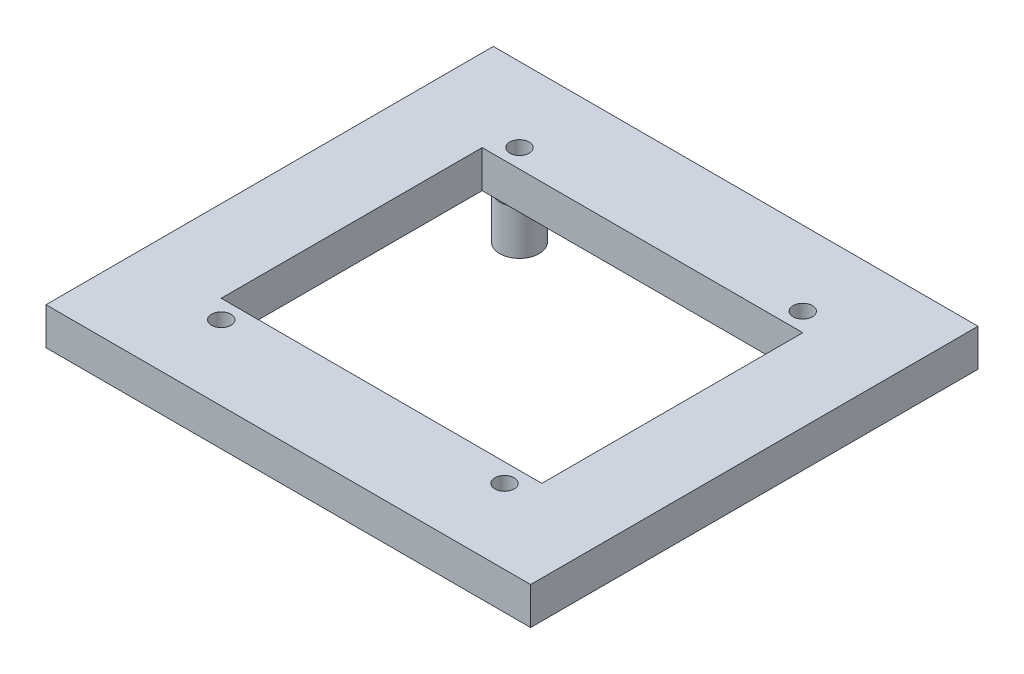
ISO-10303-21;
HEADER;
FILE_DESCRIPTION(('STEP AP214'),'2;1');
FILE_NAME('part.step','',(''),(''),'','','');
FILE_SCHEMA(('AUTOMOTIVE_DESIGN { 1 0 10303 214 1 1 1 1 }'));
ENDSEC;
DATA;
#1=APPLICATION_CONTEXT('core data for automotive mechanical design processes');
#2=APPLICATION_PROTOCOL_DEFINITION('international standard','automotive_design',2000,#1);
#3=PRODUCT_CONTEXT('',#1,'mechanical');
#4=PRODUCT('Part','Part','',(#3));
#5=PRODUCT_RELATED_PRODUCT_CATEGORY('part','',(#4));
#6=PRODUCT_DEFINITION_FORMATION('','',#4);
#7=PRODUCT_DEFINITION_CONTEXT('part definition',#1,'design');
#8=PRODUCT_DEFINITION('design','',#6,#7);
#9=PRODUCT_DEFINITION_SHAPE('','',#8);
#10=(LENGTH_UNIT() NAMED_UNIT(*) SI_UNIT(.MILLI.,.METRE.));
#11=(NAMED_UNIT(*) PLANE_ANGLE_UNIT() SI_UNIT($,.RADIAN.));
#12=(NAMED_UNIT(*) SI_UNIT($,.STERADIAN.) SOLID_ANGLE_UNIT());
#13=UNCERTAINTY_MEASURE_WITH_UNIT(LENGTH_MEASURE(1.E-05),#10,'distance_accuracy_value','');
#14=(GEOMETRIC_REPRESENTATION_CONTEXT(3) GLOBAL_UNCERTAINTY_ASSIGNED_CONTEXT((#13)) GLOBAL_UNIT_ASSIGNED_CONTEXT((#10,
#11,#12)) REPRESENTATION_CONTEXT('',''));
#15=CARTESIAN_POINT('',(0.,0.,0.));
#16=DIRECTION('',(0.,0.,1.));
#17=DIRECTION('',(1.,0.,0.));
#18=AXIS2_PLACEMENT_3D('',#15,#16,#17);
#19=CARTESIAN_POINT('',(-47.,5.,-30.));
#20=DIRECTION('',(0.,0.,-1.));
#21=DIRECTION('',(-1.,0.,0.));
#22=AXIS2_PLACEMENT_3D('',#19,#20,#21);
#23=PLANE('',#22);
#24=DIRECTION('',(1.,0.,0.));
#25=VECTOR('',#24,1.);
#26=CARTESIAN_POINT('',(-47.,0.,-30.));
#27=LINE('',#26,#25);
#28=CARTESIAN_POINT('',(-47.,0.,-30.));
#29=VERTEX_POINT('',#28);
#30=CARTESIAN_POINT('',(18.,0.,-30.));
#31=VERTEX_POINT('',#30);
#32=EDGE_CURVE('E196',#29,#31,#27,.T.);
#33=ORIENTED_EDGE('',*,*,#32,.F.);
#34=DIRECTION('',(0.,-1.,0.));
#35=VECTOR('',#34,1.);
#36=CARTESIAN_POINT('',(-47.,5.,-30.));
#37=LINE('',#36,#35);
#38=CARTESIAN_POINT('',(-47.,5.,-30.));
#39=VERTEX_POINT('',#38);
#40=EDGE_CURVE('E11',#39,#29,#37,.T.);
#41=ORIENTED_EDGE('',*,*,#40,.F.);
#42=DIRECTION('',(1.,0.,0.));
#43=VECTOR('',#42,1.);
#44=CARTESIAN_POINT('',(-47.,5.,-30.));
#45=LINE('',#44,#43);
#46=CARTESIAN_POINT('',(18.,5.,-30.));
#47=VERTEX_POINT('',#46);
#48=EDGE_CURVE('E197',#39,#47,#45,.T.);
#49=ORIENTED_EDGE('',*,*,#48,.T.);
#50=DIRECTION('',(0.,-1.,0.));
#51=VECTOR('',#50,1.);
#52=CARTESIAN_POINT('',(18.,5.,-30.));
#53=LINE('',#52,#51);
#54=EDGE_CURVE('E46',#47,#31,#53,.T.);
#55=ORIENTED_EDGE('',*,*,#54,.T.);
#56=EDGE_LOOP('',(#33,#41,#49,#55));
#57=FACE_BOUND('',#56,.T.);
#58=ADVANCED_FACE('F43',(#57),#23,.T.);
#59=CARTESIAN_POINT('',(-47.,5.,-30.));
#60=DIRECTION('',(1.,0.,0.));
#61=DIRECTION('',(0.,0.,-1.));
#62=AXIS2_PLACEMENT_3D('',#59,#60,#61);
#63=PLANE('',#62);
#64=DIRECTION('',(0.,0.,1.));
#65=VECTOR('',#64,1.);
#66=CARTESIAN_POINT('',(-47.,0.,-30.));
#67=LINE('',#66,#65);
#68=CARTESIAN_POINT('',(-47.,0.,30.));
#69=VERTEX_POINT('',#68);
#70=EDGE_CURVE('E201',#29,#69,#67,.T.);
#71=ORIENTED_EDGE('',*,*,#70,.T.);
#72=DIRECTION('',(0.,-1.,0.));
#73=VECTOR('',#72,1.);
#74=CARTESIAN_POINT('',(-47.,5.,30.));
#75=LINE('',#74,#73);
#76=CARTESIAN_POINT('',(-47.,5.,30.));
#77=VERTEX_POINT('',#76);
#78=EDGE_CURVE('E51',#77,#69,#75,.T.);
#79=ORIENTED_EDGE('',*,*,#78,.F.);
#80=DIRECTION('',(0.,0.,1.));
#81=VECTOR('',#80,1.);
#82=CARTESIAN_POINT('',(-47.,5.,-30.));
#83=LINE('',#82,#81);
#84=EDGE_CURVE('E206',#39,#77,#83,.T.);
#85=ORIENTED_EDGE('',*,*,#84,.F.);
#86=ORIENTED_EDGE('',*,*,#40,.T.);
#87=EDGE_LOOP('',(#71,#79,#85,#86));
#88=FACE_BOUND('',#87,.T.);
#89=ADVANCED_FACE('F231',(#88),#63,.F.);
#90=CARTESIAN_POINT('',(-47.,5.,30.));
#91=DIRECTION('',(0.,0.,-1.));
#92=DIRECTION('',(-1.,0.,0.));
#93=AXIS2_PLACEMENT_3D('',#90,#91,#92);
#94=PLANE('',#93);
#95=DIRECTION('',(1.,0.,0.));
#96=VECTOR('',#95,1.);
#97=CARTESIAN_POINT('',(-47.,0.,30.));
#98=LINE('',#97,#96);
#99=CARTESIAN_POINT('',(18.,0.,30.));
#100=VERTEX_POINT('',#99);
#101=EDGE_CURVE('E213',#69,#100,#98,.T.);
#102=ORIENTED_EDGE('',*,*,#101,.T.);
#103=DIRECTION('',(0.,-1.,0.));
#104=VECTOR('',#103,1.);
#105=CARTESIAN_POINT('',(18.,5.,30.));
#106=LINE('',#105,#104);
#107=CARTESIAN_POINT('',(18.,5.,30.));
#108=VERTEX_POINT('',#107);
#109=EDGE_CURVE('E218',#108,#100,#106,.T.);
#110=ORIENTED_EDGE('',*,*,#109,.F.);
#111=DIRECTION('',(1.,0.,0.));
#112=VECTOR('',#111,1.);
#113=CARTESIAN_POINT('',(-47.,5.,30.));
#114=LINE('',#113,#112);
#115=EDGE_CURVE('E204',#77,#108,#114,.T.);
#116=ORIENTED_EDGE('',*,*,#115,.F.);
#117=ORIENTED_EDGE('',*,*,#78,.T.);
#118=EDGE_LOOP('',(#102,#110,#116,#117));
#119=FACE_BOUND('',#118,.T.);
#120=ADVANCED_FACE('F235',(#119),#94,.F.);
#121=CARTESIAN_POINT('',(18.,5.,-30.));
#122=DIRECTION('',(1.,0.,0.));
#123=DIRECTION('',(0.,0.,-1.));
#124=AXIS2_PLACEMENT_3D('',#121,#122,#123);
#125=PLANE('',#124);
#126=DIRECTION('',(0.,0.,1.));
#127=VECTOR('',#126,1.);
#128=CARTESIAN_POINT('',(18.,0.,-30.));
#129=LINE('',#128,#127);
#130=EDGE_CURVE('E210',#31,#100,#129,.T.);
#131=ORIENTED_EDGE('',*,*,#130,.F.);
#132=ORIENTED_EDGE('',*,*,#54,.F.);
#133=DIRECTION('',(0.,0.,1.));
#134=VECTOR('',#133,1.);
#135=CARTESIAN_POINT('',(18.,5.,-30.));
#136=LINE('',#135,#134);
#137=EDGE_CURVE('E200',#47,#108,#136,.T.);
#138=ORIENTED_EDGE('',*,*,#137,.T.);
#139=ORIENTED_EDGE('',*,*,#109,.T.);
#140=EDGE_LOOP('',(#131,#132,#138,#139));
#141=FACE_BOUND('',#140,.T.);
#142=ADVANCED_FACE('F226',(#141),#125,.T.);
#143=CARTESIAN_POINT('',(0.,5.,0.));
#144=DIRECTION('',(0.,-1.,0.));
#145=DIRECTION('',(0.,0.,-1.));
#146=AXIS2_PLACEMENT_3D('',#143,#144,#145);
#147=PLANE('',#146);
#148=CARTESIAN_POINT('',(-33.5,5.,20.));
#149=DIRECTION('',(0.,1.,0.));
#150=DIRECTION('',(0.,0.,1.));
#151=AXIS2_PLACEMENT_3D('',#148,#149,#150);
#152=CIRCLE('',#151,1.29999999999999);
#153=CARTESIAN_POINT('',(-33.5,5.,21.3));
#154=VERTEX_POINT('',#153);
#155=EDGE_CURVE('E584',#154,#154,#152,.T.);
#156=ORIENTED_EDGE('',*,*,#155,.F.);
#157=EDGE_LOOP('',(#156));
#158=FACE_BOUND('',#157,.T.);
#159=CARTESIAN_POINT('',(4.50000000000001,5.,20.));
#160=DIRECTION('',(0.,1.,0.));
#161=DIRECTION('',(0.,0.,1.));
#162=AXIS2_PLACEMENT_3D('',#159,#160,#161);
#163=CIRCLE('',#162,1.3);
#164=CARTESIAN_POINT('',(4.50000000000001,5.,21.3));
#165=VERTEX_POINT('',#164);
#166=EDGE_CURVE('E598',#165,#165,#163,.T.);
#167=ORIENTED_EDGE('',*,*,#166,.F.);
#168=EDGE_LOOP('',(#167));
#169=FACE_BOUND('',#168,.T.);
#170=CARTESIAN_POINT('',(4.49999999999999,5.,-20.));
#171=DIRECTION('',(0.,1.,0.));
#172=DIRECTION('',(0.,0.,1.));
#173=AXIS2_PLACEMENT_3D('',#170,#171,#172);
#174=CIRCLE('',#173,1.3);
#175=CARTESIAN_POINT('',(4.49999999999999,5.,-18.7));
#176=VERTEX_POINT('',#175);
#177=EDGE_CURVE('E592',#176,#176,#174,.T.);
#178=ORIENTED_EDGE('',*,*,#177,.F.);
#179=EDGE_LOOP('',(#178));
#180=FACE_BOUND('',#179,.T.);
#181=CARTESIAN_POINT('',(-33.5,5.,-20.));
#182=DIRECTION('',(0.,1.,0.));
#183=DIRECTION('',(0.,0.,1.));
#184=AXIS2_PLACEMENT_3D('',#181,#182,#183);
#185=CIRCLE('',#184,1.29999999999999);
#186=CARTESIAN_POINT('',(-33.5,5.,-18.7));
#187=VERTEX_POINT('',#186);
#188=EDGE_CURVE('E606',#187,#187,#185,.T.);
#189=ORIENTED_EDGE('',*,*,#188,.F.);
#190=EDGE_LOOP('',(#189));
#191=FACE_BOUND('',#190,.T.);
#192=DIRECTION('',(-1.,0.,0.));
#193=VECTOR('',#192,1.);
#194=CARTESIAN_POINT('',(0.,5.,17.5));
#195=LINE('',#194,#193);
#196=CARTESIAN_POINT('',(7.00000000000001,5.,17.5));
#197=VERTEX_POINT('',#196);
#198=CARTESIAN_POINT('',(-36.,5.,17.5));
#199=VERTEX_POINT('',#198);
#200=EDGE_CURVE('E190',#197,#199,#195,.T.);
#201=ORIENTED_EDGE('',*,*,#200,.T.);
#202=DIRECTION('',(0.,0.,-1.));
#203=VECTOR('',#202,1.);
#204=CARTESIAN_POINT('',(-36.,5.,0.));
#205=LINE('',#204,#203);
#206=CARTESIAN_POINT('',(-36.,5.,-17.5));
#207=VERTEX_POINT('',#206);
#208=EDGE_CURVE('E193',#199,#207,#205,.T.);
#209=ORIENTED_EDGE('',*,*,#208,.T.);
#210=DIRECTION('',(1.,0.,0.));
#211=VECTOR('',#210,1.);
#212=CARTESIAN_POINT('',(0.,5.,-17.5));
#213=LINE('',#212,#211);
#214=CARTESIAN_POINT('',(7.00000000000001,5.,-17.5));
#215=VERTEX_POINT('',#214);
#216=EDGE_CURVE('E178',#207,#215,#213,.T.);
#217=ORIENTED_EDGE('',*,*,#216,.T.);
#218=DIRECTION('',(0.,0.,1.));
#219=VECTOR('',#218,1.);
#220=CARTESIAN_POINT('',(7.00000000000001,5.,0.));
#221=LINE('',#220,#219);
#222=EDGE_CURVE('E187',#215,#197,#221,.T.);
#223=ORIENTED_EDGE('',*,*,#222,.T.);
#224=EDGE_LOOP('',(#201,#209,#217,#223));
#225=FACE_BOUND('',#224,.T.);
#226=ORIENTED_EDGE('',*,*,#48,.F.);
#227=ORIENTED_EDGE('',*,*,#84,.T.);
#228=ORIENTED_EDGE('',*,*,#115,.T.);
#229=ORIENTED_EDGE('',*,*,#137,.F.);
#230=EDGE_LOOP('',(#226,#227,#228,#229));
#231=FACE_BOUND('',#230,.T.);
#232=ADVANCED_FACE('F237',(#158,#169,#180,#191,#225,#231),#147,.F.);
#233=CARTESIAN_POINT('',(0.,0.,0.));
#234=DIRECTION('',(0.,-1.,0.));
#235=DIRECTION('',(0.,0.,-1.));
#236=AXIS2_PLACEMENT_3D('',#233,#234,#235);
#237=PLANE('',#236);
#238=DIRECTION('',(1.,0.,0.));
#239=VECTOR('',#238,1.);
#240=CARTESIAN_POINT('',(-36.,0.,-17.5));
#241=LINE('',#240,#239);
#242=CARTESIAN_POINT('',(5.3789197915623,0.,-17.5));
#243=VERTEX_POINT('',#242);
#244=CARTESIAN_POINT('',(7.00000000000001,0.,-17.5));
#245=VERTEX_POINT('',#244);
#246=EDGE_CURVE('E153',#243,#245,#241,.T.);
#247=ORIENTED_EDGE('',*,*,#246,.F.);
#248=CARTESIAN_POINT('',(4.49999999999999,0.,-20.));
#249=DIRECTION('',(0.,-1.,0.));
#250=DIRECTION('',(0.,0.,-1.));
#251=AXIS2_PLACEMENT_3D('',#248,#249,#250);
#252=CIRCLE('',#251,2.65);
#253=CARTESIAN_POINT('',(3.62108020843768,0.,-17.5));
#254=VERTEX_POINT('',#253);
#255=EDGE_CURVE('E141',#254,#243,#252,.T.);
#256=ORIENTED_EDGE('',*,*,#255,.F.);
#257=CARTESIAN_POINT('',(-32.6210802084376,0.,-17.5));
#258=VERTEX_POINT('',#257);
#259=EDGE_CURVE('E150',#258,#254,#241,.T.);
#260=ORIENTED_EDGE('',*,*,#259,.F.);
#261=CARTESIAN_POINT('',(-33.5,0.,-20.));
#262=DIRECTION('',(0.,-1.,0.));
#263=DIRECTION('',(0.,0.,-1.));
#264=AXIS2_PLACEMENT_3D('',#261,#262,#263);
#265=CIRCLE('',#264,2.65000000000001);
#266=CARTESIAN_POINT('',(-34.3789197915624,0.,-17.5));
#267=VERTEX_POINT('',#266);
#268=EDGE_CURVE('E565',#267,#258,#265,.T.);
#269=ORIENTED_EDGE('',*,*,#268,.F.);
#270=CARTESIAN_POINT('',(-36.,0.,-17.5));
#271=VERTEX_POINT('',#270);
#272=EDGE_CURVE('E159',#271,#267,#241,.T.);
#273=ORIENTED_EDGE('',*,*,#272,.F.);
#274=DIRECTION('',(0.,0.,-1.));
#275=VECTOR('',#274,1.);
#276=CARTESIAN_POINT('',(-36.,0.,17.5));
#277=LINE('',#276,#275);
#278=CARTESIAN_POINT('',(-36.,0.,17.5));
#279=VERTEX_POINT('',#278);
#280=EDGE_CURVE('E162',#279,#271,#277,.T.);
#281=ORIENTED_EDGE('',*,*,#280,.F.);
#282=DIRECTION('',(-1.,0.,0.));
#283=VECTOR('',#282,1.);
#284=CARTESIAN_POINT('',(-36.,0.,17.5));
#285=LINE('',#284,#283);
#286=CARTESIAN_POINT('',(-34.3789197915623,0.,17.5));
#287=VERTEX_POINT('',#286);
#288=EDGE_CURVE('E168',#287,#279,#285,.T.);
#289=ORIENTED_EDGE('',*,*,#288,.F.);
#290=CARTESIAN_POINT('',(-33.5,0.,20.));
#291=DIRECTION('',(0.,-1.,0.));
#292=DIRECTION('',(0.,0.,-1.));
#293=AXIS2_PLACEMENT_3D('',#290,#291,#292);
#294=CIRCLE('',#293,2.65);
#295=CARTESIAN_POINT('',(-32.6210802084377,0.,17.5));
#296=VERTEX_POINT('',#295);
#297=EDGE_CURVE('E585',#296,#287,#294,.T.);
#298=ORIENTED_EDGE('',*,*,#297,.F.);
#299=CARTESIAN_POINT('',(3.62108020843765,0.,17.5));
#300=VERTEX_POINT('',#299);
#301=EDGE_CURVE('E173',#300,#296,#285,.T.);
#302=ORIENTED_EDGE('',*,*,#301,.F.);
#303=CARTESIAN_POINT('',(4.50000000000001,0.,20.));
#304=DIRECTION('',(0.,-1.,0.));
#305=DIRECTION('',(0.,0.,-1.));
#306=AXIS2_PLACEMENT_3D('',#303,#304,#305);
#307=CIRCLE('',#306,2.65);
#308=CARTESIAN_POINT('',(5.37891979156238,0.,17.5));
#309=VERTEX_POINT('',#308);
#310=EDGE_CURVE('E65',#309,#300,#307,.T.);
#311=ORIENTED_EDGE('',*,*,#310,.F.);
#312=CARTESIAN_POINT('',(7.00000000000001,0.,17.5));
#313=VERTEX_POINT('',#312);
#314=EDGE_CURVE('E169',#313,#309,#285,.T.);
#315=ORIENTED_EDGE('',*,*,#314,.F.);
#316=DIRECTION('',(0.,0.,1.));
#317=VECTOR('',#316,1.);
#318=CARTESIAN_POINT('',(7.00000000000001,0.,17.5));
#319=LINE('',#318,#317);
#320=EDGE_CURVE('E161',#245,#313,#319,.T.);
#321=ORIENTED_EDGE('',*,*,#320,.F.);
#322=EDGE_LOOP('',(#247,#256,#260,#269,#273,#281,#289,#298,#302,#311,#315,#321));
#323=FACE_BOUND('',#322,.T.);
#324=ORIENTED_EDGE('',*,*,#32,.T.);
#325=ORIENTED_EDGE('',*,*,#130,.T.);
#326=ORIENTED_EDGE('',*,*,#101,.F.);
#327=ORIENTED_EDGE('',*,*,#70,.F.);
#328=EDGE_LOOP('',(#324,#325,#326,#327));
#329=FACE_BOUND('',#328,.T.);
#330=ADVANCED_FACE('F147',(#323,#329),#237,.T.);
#331=CARTESIAN_POINT('',(-36.,10.,17.5));
#332=DIRECTION('',(-1.,0.,0.));
#333=DIRECTION('',(0.,0.,1.));
#334=AXIS2_PLACEMENT_3D('',#331,#332,#333);
#335=PLANE('',#334);
#336=DIRECTION('',(0.,-1.,0.));
#337=VECTOR('',#336,1.);
#338=CARTESIAN_POINT('',(-36.,10.,17.5));
#339=LINE('',#338,#337);
#340=EDGE_CURVE('E175',#199,#279,#339,.T.);
#341=ORIENTED_EDGE('',*,*,#340,.T.);
#342=ORIENTED_EDGE('',*,*,#280,.T.);
#343=DIRECTION('',(0.,-1.,0.));
#344=VECTOR('',#343,1.);
#345=CARTESIAN_POINT('',(-36.,10.,-17.5));
#346=LINE('',#345,#344);
#347=EDGE_CURVE('E172',#207,#271,#346,.T.);
#348=ORIENTED_EDGE('',*,*,#347,.F.);
#349=ORIENTED_EDGE('',*,*,#208,.F.);
#350=EDGE_LOOP('',(#341,#342,#348,#349));
#351=FACE_BOUND('',#350,.T.);
#352=ADVANCED_FACE('F246',(#351),#335,.F.);
#353=CARTESIAN_POINT('',(-36.,10.,17.5));
#354=DIRECTION('',(0.,0.,1.));
#355=DIRECTION('',(1.,0.,0.));
#356=AXIS2_PLACEMENT_3D('',#353,#354,#355);
#357=PLANE('',#356);
#358=DIRECTION('',(0.,-1.,0.));
#359=VECTOR('',#358,1.);
#360=CARTESIAN_POINT('',(7.00000000000001,10.,17.5));
#361=LINE('',#360,#359);
#362=EDGE_CURVE('E179',#197,#313,#361,.T.);
#363=ORIENTED_EDGE('',*,*,#362,.T.);
#364=ORIENTED_EDGE('',*,*,#314,.T.);
#365=DIRECTION('',(1.,0.,0.));
#366=VECTOR('',#365,1.);
#367=CARTESIAN_POINT('',(-36.,0.,17.5));
#368=LINE('',#367,#366);
#369=EDGE_CURVE('E557',#300,#309,#368,.T.);
#370=ORIENTED_EDGE('',*,*,#369,.F.);
#371=ORIENTED_EDGE('',*,*,#301,.T.);
#372=EDGE_CURVE('E174',#296,#287,#285,.T.);
#373=ORIENTED_EDGE('',*,*,#372,.T.);
#374=ORIENTED_EDGE('',*,*,#288,.T.);
#375=ORIENTED_EDGE('',*,*,#340,.F.);
#376=ORIENTED_EDGE('',*,*,#200,.F.);
#377=EDGE_LOOP('',(#363,#364,#370,#371,#373,#374,#375,#376));
#378=FACE_BOUND('',#377,.T.);
#379=ADVANCED_FACE('F274',(#378),#357,.F.);
#380=CARTESIAN_POINT('',(7.00000000000001,10.,17.5));
#381=DIRECTION('',(1.,0.,0.));
#382=DIRECTION('',(0.,0.,-1.));
#383=AXIS2_PLACEMENT_3D('',#380,#381,#382);
#384=PLANE('',#383);
#385=DIRECTION('',(0.,-1.,0.));
#386=VECTOR('',#385,1.);
#387=CARTESIAN_POINT('',(7.00000000000001,10.,-17.5));
#388=LINE('',#387,#386);
#389=EDGE_CURVE('E181',#215,#245,#388,.T.);
#390=ORIENTED_EDGE('',*,*,#389,.T.);
#391=ORIENTED_EDGE('',*,*,#320,.T.);
#392=ORIENTED_EDGE('',*,*,#362,.F.);
#393=ORIENTED_EDGE('',*,*,#222,.F.);
#394=EDGE_LOOP('',(#390,#391,#392,#393));
#395=FACE_BOUND('',#394,.T.);
#396=ADVANCED_FACE('F281',(#395),#384,.F.);
#397=CARTESIAN_POINT('',(-36.,10.,-17.5));
#398=DIRECTION('',(0.,0.,-1.));
#399=DIRECTION('',(-1.,0.,0.));
#400=AXIS2_PLACEMENT_3D('',#397,#398,#399);
#401=PLANE('',#400);
#402=ORIENTED_EDGE('',*,*,#347,.T.);
#403=ORIENTED_EDGE('',*,*,#272,.T.);
#404=DIRECTION('',(-1.,0.,0.));
#405=VECTOR('',#404,1.);
#406=CARTESIAN_POINT('',(-36.,0.,-17.5));
#407=LINE('',#406,#405);
#408=EDGE_CURVE('E158',#258,#267,#407,.T.);
#409=ORIENTED_EDGE('',*,*,#408,.F.);
#410=ORIENTED_EDGE('',*,*,#259,.T.);
#411=DIRECTION('',(-1.,0.,0.));
#412=VECTOR('',#411,1.);
#413=CARTESIAN_POINT('',(-36.,0.,-17.5));
#414=LINE('',#413,#412);
#415=EDGE_CURVE('E131',#243,#254,#414,.T.);
#416=ORIENTED_EDGE('',*,*,#415,.F.);
#417=ORIENTED_EDGE('',*,*,#246,.T.);
#418=ORIENTED_EDGE('',*,*,#389,.F.);
#419=ORIENTED_EDGE('',*,*,#216,.F.);
#420=EDGE_LOOP('',(#402,#403,#409,#410,#416,#417,#418,#419));
#421=FACE_BOUND('',#420,.T.);
#422=ADVANCED_FACE('F156',(#421),#401,.F.);
#423=CARTESIAN_POINT('',(-33.5,-0.00100000000000013,-20.));
#424=DIRECTION('',(0.,1.,0.));
#425=DIRECTION('',(0.,0.,1.));
#426=AXIS2_PLACEMENT_3D('',#423,#424,#425);
#427=CYLINDRICAL_SURFACE('',#426,1.29999999999999);
#428=CARTESIAN_POINT('',(-33.5,0.,-20.));
#429=DIRECTION('',(0.,-1.,0.));
#430=DIRECTION('',(0.,0.,-1.));
#431=AXIS2_PLACEMENT_3D('',#428,#429,#430);
#432=CIRCLE('',#431,1.29999999999999);
#433=CARTESIAN_POINT('',(-33.5,0.,-21.3));
#434=VERTEX_POINT('',#433);
#435=EDGE_CURVE('E591',#434,#434,#432,.F.);
#436=ORIENTED_EDGE('',*,*,#435,.F.);
#437=EDGE_LOOP('',(#436));
#438=FACE_BOUND('',#437,.T.);
#439=ORIENTED_EDGE('',*,*,#188,.T.);
#440=EDGE_LOOP('',(#439));
#441=FACE_BOUND('',#440,.T.);
#442=ADVANCED_FACE('F300',(#438,#441),#427,.F.);
#443=CARTESIAN_POINT('',(4.49999999999999,-0.00100000000000013,-20.));
#444=DIRECTION('',(0.,1.,0.));
#445=DIRECTION('',(0.,0.,1.));
#446=AXIS2_PLACEMENT_3D('',#443,#444,#445);
#447=CYLINDRICAL_SURFACE('',#446,1.3);
#448=CARTESIAN_POINT('',(4.49999999999999,0.,-20.));
#449=DIRECTION('',(0.,-1.,0.));
#450=DIRECTION('',(0.,0.,-1.));
#451=AXIS2_PLACEMENT_3D('',#448,#449,#450);
#452=CIRCLE('',#451,1.3);
#453=CARTESIAN_POINT('',(4.49999999999999,0.,-21.3));
#454=VERTEX_POINT('',#453);
#455=EDGE_CURVE('E588',#454,#454,#452,.F.);
#456=ORIENTED_EDGE('',*,*,#455,.F.);
#457=EDGE_LOOP('',(#456));
#458=FACE_BOUND('',#457,.T.);
#459=ORIENTED_EDGE('',*,*,#177,.T.);
#460=EDGE_LOOP('',(#459));
#461=FACE_BOUND('',#460,.T.);
#462=ADVANCED_FACE('F309',(#458,#461),#447,.F.);
#463=CARTESIAN_POINT('',(4.50000000000001,-0.00100000000000013,20.));
#464=DIRECTION('',(0.,1.,0.));
#465=DIRECTION('',(0.,0.,1.));
#466=AXIS2_PLACEMENT_3D('',#463,#464,#465);
#467=CYLINDRICAL_SURFACE('',#466,1.3);
#468=CARTESIAN_POINT('',(4.50000000000001,0.,20.));
#469=DIRECTION('',(0.,-1.,0.));
#470=DIRECTION('',(0.,0.,-1.));
#471=AXIS2_PLACEMENT_3D('',#468,#469,#470);
#472=CIRCLE('',#471,1.3);
#473=CARTESIAN_POINT('',(4.50000000000001,0.,18.7));
#474=VERTEX_POINT('',#473);
#475=EDGE_CURVE('E595',#474,#474,#472,.F.);
#476=ORIENTED_EDGE('',*,*,#475,.F.);
#477=EDGE_LOOP('',(#476));
#478=FACE_BOUND('',#477,.T.);
#479=ORIENTED_EDGE('',*,*,#166,.T.);
#480=EDGE_LOOP('',(#479));
#481=FACE_BOUND('',#480,.T.);
#482=ADVANCED_FACE('F319',(#478,#481),#467,.F.);
#483=CARTESIAN_POINT('',(-33.5,-0.00100000000000013,20.));
#484=DIRECTION('',(0.,1.,0.));
#485=DIRECTION('',(0.,0.,1.));
#486=AXIS2_PLACEMENT_3D('',#483,#484,#485);
#487=CYLINDRICAL_SURFACE('',#486,1.29999999999999);
#488=CARTESIAN_POINT('',(-33.5,0.,20.));
#489=DIRECTION('',(0.,-1.,0.));
#490=DIRECTION('',(0.,0.,-1.));
#491=AXIS2_PLACEMENT_3D('',#488,#489,#490);
#492=CIRCLE('',#491,1.29999999999999);
#493=CARTESIAN_POINT('',(-33.5,0.,18.7));
#494=VERTEX_POINT('',#493);
#495=EDGE_CURVE('E601',#494,#494,#492,.F.);
#496=ORIENTED_EDGE('',*,*,#495,.F.);
#497=EDGE_LOOP('',(#496));
#498=FACE_BOUND('',#497,.T.);
#499=ORIENTED_EDGE('',*,*,#155,.T.);
#500=EDGE_LOOP('',(#499));
#501=FACE_BOUND('',#500,.T.);
#502=ADVANCED_FACE('F329',(#498,#501),#487,.F.);
#503=CARTESIAN_POINT('',(-33.5,0.,20.));
#504=DIRECTION('',(0.,-1.,0.));
#505=DIRECTION('',(0.,0.,-1.));
#506=AXIS2_PLACEMENT_3D('',#503,#504,#505);
#507=PLANE('',#506);
#508=CARTESIAN_POINT('',(-33.5,0.,20.));
#509=DIRECTION('',(0.,-1.,0.));
#510=DIRECTION('',(0.,0.,-1.));
#511=AXIS2_PLACEMENT_3D('',#508,#509,#510);
#512=CIRCLE('',#511,1.04999999999999);
#513=CARTESIAN_POINT('',(-33.5,0.,18.95));
#514=VERTEX_POINT('',#513);
#515=EDGE_CURVE('E574',#514,#514,#512,.T.);
#516=ORIENTED_EDGE('',*,*,#515,.T.);
#517=EDGE_LOOP('',(#516));
#518=FACE_BOUND('',#517,.T.);
#519=ORIENTED_EDGE('',*,*,#495,.T.);
#520=EDGE_LOOP('',(#519));
#521=FACE_BOUND('',#520,.T.);
#522=ADVANCED_FACE('F339',(#518,#521),#507,.F.);
#523=CARTESIAN_POINT('',(-33.5,-6.,20.));
#524=DIRECTION('',(0.,-1.,0.));
#525=DIRECTION('',(0.,0.,-1.));
#526=AXIS2_PLACEMENT_3D('',#523,#524,#525);
#527=PLANE('',#526);
#528=CARTESIAN_POINT('',(-33.5,-6.,20.));
#529=DIRECTION('',(0.,-1.,0.));
#530=DIRECTION('',(0.,0.,-1.));
#531=AXIS2_PLACEMENT_3D('',#528,#529,#530);
#532=CIRCLE('',#531,2.65);
#533=CARTESIAN_POINT('',(-33.5,-6.,17.35));
#534=VERTEX_POINT('',#533);
#535=EDGE_CURVE('E581',#534,#534,#532,.T.);
#536=ORIENTED_EDGE('',*,*,#535,.T.);
#537=EDGE_LOOP('',(#536));
#538=FACE_BOUND('',#537,.T.);
#539=CARTESIAN_POINT('',(-33.5,-6.,20.));
#540=DIRECTION('',(0.,-1.,0.));
#541=DIRECTION('',(0.,0.,-1.));
#542=AXIS2_PLACEMENT_3D('',#539,#540,#541);
#543=CIRCLE('',#542,1.04999999999999);
#544=CARTESIAN_POINT('',(-33.5,-6.,18.95));
#545=VERTEX_POINT('',#544);
#546=EDGE_CURVE('E575',#545,#545,#543,.T.);
#547=ORIENTED_EDGE('',*,*,#546,.F.);
#548=EDGE_LOOP('',(#547));
#549=FACE_BOUND('',#548,.T.);
#550=ADVANCED_FACE('F348',(#538,#549),#527,.T.);
#551=ORIENTED_EDGE('',*,*,#372,.F.);
#552=EDGE_CURVE('E578',#287,#296,#294,.T.);
#553=ORIENTED_EDGE('',*,*,#552,.F.);
#554=EDGE_LOOP('',(#551,#553));
#555=FACE_BOUND('',#554,.T.);
#556=ADVANCED_FACE('F351',(#555),#507,.F.);
#557=CARTESIAN_POINT('',(-33.5,-6.,20.));
#558=DIRECTION('',(0.,1.,0.));
#559=DIRECTION('',(0.,0.,1.));
#560=AXIS2_PLACEMENT_3D('',#557,#558,#559);
#561=CYLINDRICAL_SURFACE('',#560,2.65);
#562=ORIENTED_EDGE('',*,*,#535,.F.);
#563=EDGE_LOOP('',(#562));
#564=FACE_BOUND('',#563,.T.);
#565=ORIENTED_EDGE('',*,*,#297,.T.);
#566=ORIENTED_EDGE('',*,*,#552,.T.);
#567=EDGE_LOOP('',(#565,#566));
#568=FACE_BOUND('',#567,.T.);
#569=ADVANCED_FACE('F368',(#564,#568),#561,.T.);
#570=CARTESIAN_POINT('',(-33.5,-6.,20.));
#571=DIRECTION('',(0.,1.,0.));
#572=DIRECTION('',(0.,0.,1.));
#573=AXIS2_PLACEMENT_3D('',#570,#571,#572);
#574=CYLINDRICAL_SURFACE('',#573,1.04999999999999);
#575=ORIENTED_EDGE('',*,*,#546,.T.);
#576=EDGE_LOOP('',(#575));
#577=FACE_BOUND('',#576,.T.);
#578=ORIENTED_EDGE('',*,*,#515,.F.);
#579=EDGE_LOOP('',(#578));
#580=FACE_BOUND('',#579,.T.);
#581=ADVANCED_FACE('F377',(#577,#580),#574,.F.);
#582=CARTESIAN_POINT('',(-33.5,0.,-20.));
#583=DIRECTION('',(0.,-1.,0.));
#584=DIRECTION('',(0.,0.,-1.));
#585=AXIS2_PLACEMENT_3D('',#582,#583,#584);
#586=PLANE('',#585);
#587=EDGE_CURVE('E561',#258,#267,#265,.T.);
#588=ORIENTED_EDGE('',*,*,#587,.F.);
#589=ORIENTED_EDGE('',*,*,#408,.T.);
#590=EDGE_LOOP('',(#588,#589));
#591=FACE_BOUND('',#590,.T.);
#592=ADVANCED_FACE('F387',(#591),#586,.F.);
#593=CARTESIAN_POINT('',(-33.5,0.,-20.));
#594=DIRECTION('',(0.,-1.,0.));
#595=DIRECTION('',(0.,0.,-1.));
#596=AXIS2_PLACEMENT_3D('',#593,#594,#595);
#597=CIRCLE('',#596,1.05);
#598=CARTESIAN_POINT('',(-33.5,0.,-21.05));
#599=VERTEX_POINT('',#598);
#600=EDGE_CURVE('E568',#599,#599,#597,.T.);
#601=ORIENTED_EDGE('',*,*,#600,.T.);
#602=EDGE_LOOP('',(#601));
#603=FACE_BOUND('',#602,.T.);
#604=ORIENTED_EDGE('',*,*,#435,.T.);
#605=EDGE_LOOP('',(#604));
#606=FACE_BOUND('',#605,.T.);
#607=ADVANCED_FACE('F397',(#603,#606),#586,.F.);
#608=CARTESIAN_POINT('',(-33.5,-6.,-20.));
#609=DIRECTION('',(0.,-1.,0.));
#610=DIRECTION('',(0.,0.,-1.));
#611=AXIS2_PLACEMENT_3D('',#608,#609,#610);
#612=PLANE('',#611);
#613=CARTESIAN_POINT('',(-33.5,-6.,-20.));
#614=DIRECTION('',(0.,-1.,0.));
#615=DIRECTION('',(0.,0.,-1.));
#616=AXIS2_PLACEMENT_3D('',#613,#614,#615);
#617=CIRCLE('',#616,2.65000000000001);
#618=CARTESIAN_POINT('',(-33.5,-6.,-22.65));
#619=VERTEX_POINT('',#618);
#620=EDGE_CURVE('E560',#619,#619,#617,.T.);
#621=ORIENTED_EDGE('',*,*,#620,.T.);
#622=EDGE_LOOP('',(#621));
#623=FACE_BOUND('',#622,.T.);
#624=CARTESIAN_POINT('',(-33.5,-6.,-20.));
#625=DIRECTION('',(0.,-1.,0.));
#626=DIRECTION('',(0.,0.,-1.));
#627=AXIS2_PLACEMENT_3D('',#624,#625,#626);
#628=CIRCLE('',#627,1.05);
#629=CARTESIAN_POINT('',(-33.5,-6.,-21.05));
#630=VERTEX_POINT('',#629);
#631=EDGE_CURVE('E564',#630,#630,#628,.T.);
#632=ORIENTED_EDGE('',*,*,#631,.F.);
#633=EDGE_LOOP('',(#632));
#634=FACE_BOUND('',#633,.T.);
#635=ADVANCED_FACE('F407',(#623,#634),#612,.T.);
#636=CARTESIAN_POINT('',(-33.5,-6.,-20.));
#637=DIRECTION('',(0.,1.,0.));
#638=DIRECTION('',(0.,0.,1.));
#639=AXIS2_PLACEMENT_3D('',#636,#637,#638);
#640=CYLINDRICAL_SURFACE('',#639,2.65000000000001);
#641=ORIENTED_EDGE('',*,*,#620,.F.);
#642=EDGE_LOOP('',(#641));
#643=FACE_BOUND('',#642,.T.);
#644=ORIENTED_EDGE('',*,*,#587,.T.);
#645=ORIENTED_EDGE('',*,*,#268,.T.);
#646=EDGE_LOOP('',(#644,#645));
#647=FACE_BOUND('',#646,.T.);
#648=ADVANCED_FACE('F416',(#643,#647),#640,.T.);
#649=CARTESIAN_POINT('',(-33.5,-6.,-20.));
#650=DIRECTION('',(0.,1.,0.));
#651=DIRECTION('',(0.,0.,1.));
#652=AXIS2_PLACEMENT_3D('',#649,#650,#651);
#653=CYLINDRICAL_SURFACE('',#652,1.05);
#654=ORIENTED_EDGE('',*,*,#631,.T.);
#655=EDGE_LOOP('',(#654));
#656=FACE_BOUND('',#655,.T.);
#657=ORIENTED_EDGE('',*,*,#600,.F.);
#658=EDGE_LOOP('',(#657));
#659=FACE_BOUND('',#658,.T.);
#660=ADVANCED_FACE('F426',(#656,#659),#653,.F.);
#661=CARTESIAN_POINT('',(4.50000000000001,0.,20.));
#662=DIRECTION('',(0.,-1.,0.));
#663=DIRECTION('',(0.,0.,-1.));
#664=AXIS2_PLACEMENT_3D('',#661,#662,#663);
#665=PLANE('',#664);
#666=EDGE_CURVE('E547',#300,#309,#307,.T.);
#667=ORIENTED_EDGE('',*,*,#666,.F.);
#668=ORIENTED_EDGE('',*,*,#369,.T.);
#669=EDGE_LOOP('',(#667,#668));
#670=FACE_BOUND('',#669,.T.);
#671=ADVANCED_FACE('F436',(#670),#665,.F.);
#672=CARTESIAN_POINT('',(4.50000000000001,0.,20.));
#673=DIRECTION('',(0.,-1.,0.));
#674=DIRECTION('',(0.,0.,-1.));
#675=AXIS2_PLACEMENT_3D('',#672,#673,#674);
#676=CIRCLE('',#675,1.05);
#677=CARTESIAN_POINT('',(4.50000000000001,0.,18.95));
#678=VERTEX_POINT('',#677);
#679=EDGE_CURVE('E550',#678,#678,#676,.T.);
#680=ORIENTED_EDGE('',*,*,#679,.T.);
#681=EDGE_LOOP('',(#680));
#682=FACE_BOUND('',#681,.T.);
#683=ORIENTED_EDGE('',*,*,#475,.T.);
#684=EDGE_LOOP('',(#683));
#685=FACE_BOUND('',#684,.T.);
#686=ADVANCED_FACE('F446',(#682,#685),#665,.F.);
#687=CARTESIAN_POINT('',(4.50000000000001,-6.,20.));
#688=DIRECTION('',(0.,-1.,0.));
#689=DIRECTION('',(0.,0.,-1.));
#690=AXIS2_PLACEMENT_3D('',#687,#688,#689);
#691=PLANE('',#690);
#692=CARTESIAN_POINT('',(4.50000000000001,-6.,20.));
#693=DIRECTION('',(0.,-1.,0.));
#694=DIRECTION('',(0.,0.,-1.));
#695=AXIS2_PLACEMENT_3D('',#692,#693,#694);
#696=CIRCLE('',#695,2.65);
#697=CARTESIAN_POINT('',(4.50000000000001,-6.,17.35));
#698=VERTEX_POINT('',#697);
#699=EDGE_CURVE('E135',#698,#698,#696,.T.);
#700=ORIENTED_EDGE('',*,*,#699,.T.);
#701=EDGE_LOOP('',(#700));
#702=FACE_BOUND('',#701,.T.);
#703=CARTESIAN_POINT('',(4.50000000000001,-6.,20.));
#704=DIRECTION('',(0.,-1.,0.));
#705=DIRECTION('',(0.,0.,-1.));
#706=AXIS2_PLACEMENT_3D('',#703,#704,#705);
#707=CIRCLE('',#706,1.05);
#708=CARTESIAN_POINT('',(4.50000000000001,-6.,18.95));
#709=VERTEX_POINT('',#708);
#710=EDGE_CURVE('E546',#709,#709,#707,.T.);
#711=ORIENTED_EDGE('',*,*,#710,.F.);
#712=EDGE_LOOP('',(#711));
#713=FACE_BOUND('',#712,.T.);
#714=ADVANCED_FACE('F456',(#702,#713),#691,.T.);
#715=CARTESIAN_POINT('',(4.50000000000001,-6.,20.));
#716=DIRECTION('',(0.,1.,0.));
#717=DIRECTION('',(0.,0.,1.));
#718=AXIS2_PLACEMENT_3D('',#715,#716,#717);
#719=CYLINDRICAL_SURFACE('',#718,2.65);
#720=ORIENTED_EDGE('',*,*,#699,.F.);
#721=EDGE_LOOP('',(#720));
#722=FACE_BOUND('',#721,.T.);
#723=ORIENTED_EDGE('',*,*,#310,.T.);
#724=ORIENTED_EDGE('',*,*,#666,.T.);
#725=EDGE_LOOP('',(#723,#724));
#726=FACE_BOUND('',#725,.T.);
#727=ADVANCED_FACE('F465',(#722,#726),#719,.T.);
#728=CARTESIAN_POINT('',(4.50000000000001,-6.,20.));
#729=DIRECTION('',(0.,1.,0.));
#730=DIRECTION('',(0.,0.,1.));
#731=AXIS2_PLACEMENT_3D('',#728,#729,#730);
#732=CYLINDRICAL_SURFACE('',#731,1.05);
#733=ORIENTED_EDGE('',*,*,#710,.T.);
#734=EDGE_LOOP('',(#733));
#735=FACE_BOUND('',#734,.T.);
#736=ORIENTED_EDGE('',*,*,#679,.F.);
#737=EDGE_LOOP('',(#736));
#738=FACE_BOUND('',#737,.T.);
#739=ADVANCED_FACE('F475',(#735,#738),#732,.F.);
#740=CARTESIAN_POINT('',(4.49999999999999,0.,-20.));
#741=DIRECTION('',(0.,-1.,0.));
#742=DIRECTION('',(0.,0.,-1.));
#743=AXIS2_PLACEMENT_3D('',#740,#741,#742);
#744=PLANE('',#743);
#745=EDGE_CURVE('E58',#243,#254,#252,.T.);
#746=ORIENTED_EDGE('',*,*,#745,.F.);
#747=ORIENTED_EDGE('',*,*,#415,.T.);
#748=EDGE_LOOP('',(#746,#747));
#749=FACE_BOUND('',#748,.T.);
#750=ADVANCED_FACE('F132',(#749),#744,.F.);
#751=CARTESIAN_POINT('',(4.49999999999999,0.,-20.));
#752=DIRECTION('',(0.,-1.,0.));
#753=DIRECTION('',(0.,0.,-1.));
#754=AXIS2_PLACEMENT_3D('',#751,#752,#753);
#755=CIRCLE('',#754,1.05);
#756=CARTESIAN_POINT('',(4.49999999999999,0.,-21.05));
#757=VERTEX_POINT('',#756);
#758=EDGE_CURVE('E136',#757,#757,#755,.T.);
#759=ORIENTED_EDGE('',*,*,#758,.T.);
#760=EDGE_LOOP('',(#759));
#761=FACE_BOUND('',#760,.T.);
#762=ORIENTED_EDGE('',*,*,#455,.T.);
#763=EDGE_LOOP('',(#762));
#764=FACE_BOUND('',#763,.T.);
#765=ADVANCED_FACE('F494',(#761,#764),#744,.F.);
#766=CARTESIAN_POINT('',(4.49999999999999,-6.,-20.));
#767=DIRECTION('',(0.,-1.,0.));
#768=DIRECTION('',(0.,0.,-1.));
#769=AXIS2_PLACEMENT_3D('',#766,#767,#768);
#770=PLANE('',#769);
#771=CARTESIAN_POINT('',(4.49999999999999,-6.,-20.));
#772=DIRECTION('',(0.,-1.,0.));
#773=DIRECTION('',(0.,0.,-1.));
#774=AXIS2_PLACEMENT_3D('',#771,#772,#773);
#775=CIRCLE('',#774,2.65);
#776=CARTESIAN_POINT('',(4.49999999999999,-6.,-22.65));
#777=VERTEX_POINT('',#776);
#778=EDGE_CURVE('E154',#777,#777,#775,.T.);
#779=ORIENTED_EDGE('',*,*,#778,.T.);
#780=EDGE_LOOP('',(#779));
#781=FACE_BOUND('',#780,.T.);
#782=CARTESIAN_POINT('',(4.49999999999999,-6.,-20.));
#783=DIRECTION('',(0.,-1.,0.));
#784=DIRECTION('',(0.,0.,-1.));
#785=AXIS2_PLACEMENT_3D('',#782,#783,#784);
#786=CIRCLE('',#785,1.05);
#787=CARTESIAN_POINT('',(4.49999999999999,-6.,-21.05));
#788=VERTEX_POINT('',#787);
#789=EDGE_CURVE('E143',#788,#788,#786,.T.);
#790=ORIENTED_EDGE('',*,*,#789,.F.);
#791=EDGE_LOOP('',(#790));
#792=FACE_BOUND('',#791,.T.);
#793=ADVANCED_FACE('F503',(#781,#792),#770,.T.);
#794=CARTESIAN_POINT('',(4.49999999999999,-6.,-20.));
#795=DIRECTION('',(0.,1.,0.));
#796=DIRECTION('',(0.,0.,1.));
#797=AXIS2_PLACEMENT_3D('',#794,#795,#796);
#798=CYLINDRICAL_SURFACE('',#797,2.65);
#799=ORIENTED_EDGE('',*,*,#778,.F.);
#800=EDGE_LOOP('',(#799));
#801=FACE_BOUND('',#800,.T.);
#802=ORIENTED_EDGE('',*,*,#745,.T.);
#803=ORIENTED_EDGE('',*,*,#255,.T.);
#804=EDGE_LOOP('',(#802,#803));
#805=FACE_BOUND('',#804,.T.);
#806=ADVANCED_FACE('F140',(#801,#805),#798,.T.);
#807=CARTESIAN_POINT('',(4.49999999999999,-6.,-20.));
#808=DIRECTION('',(0.,1.,0.));
#809=DIRECTION('',(0.,0.,1.));
#810=AXIS2_PLACEMENT_3D('',#807,#808,#809);
#811=CYLINDRICAL_SURFACE('',#810,1.05);
#812=ORIENTED_EDGE('',*,*,#789,.T.);
#813=EDGE_LOOP('',(#812));
#814=FACE_BOUND('',#813,.T.);
#815=ORIENTED_EDGE('',*,*,#758,.F.);
#816=EDGE_LOOP('',(#815));
#817=FACE_BOUND('',#816,.T.);
#818=ADVANCED_FACE('F521',(#814,#817),#811,.F.);
#819=CLOSED_SHELL('',(#58,#89,#120,#142,#232,#330,#352,#379,#396,#422,#442,#462,#482,#502,#522,
#550,#556,#569,#581,#592,#607,#635,#648,#660,#671,#686,#714,#727,#739,#750,#765,#793,#806,#818));
#820=MANIFOLD_SOLID_BREP('B2',#819);
#821=ADVANCED_BREP_SHAPE_REPRESENTATION('',(#18,#820),#14);
#822=SHAPE_DEFINITION_REPRESENTATION(#9,#821);
ENDSEC;
END-ISO-10303-21;
